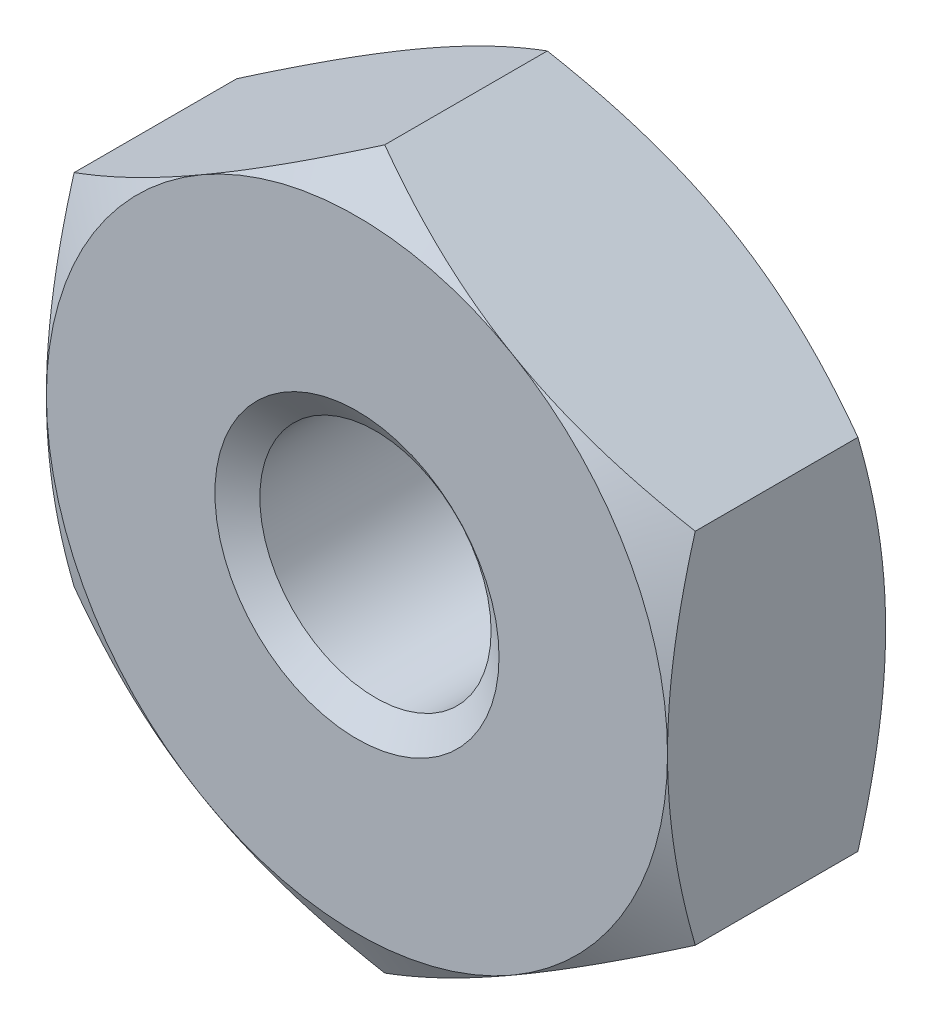
ISO-10303-21;
HEADER;
FILE_DESCRIPTION(('STEP AP214'),'2;1');
FILE_NAME('part.step','',(''),(''),'','','');
FILE_SCHEMA(('AUTOMOTIVE_DESIGN { 1 0 10303 214 1 1 1 1 }'));
ENDSEC;
DATA;
#1=APPLICATION_CONTEXT('core data for automotive mechanical design processes');
#2=APPLICATION_PROTOCOL_DEFINITION('international standard','automotive_design',2000,#1);
#3=PRODUCT_CONTEXT('',#1,'mechanical');
#4=PRODUCT('Part','Part','',(#3));
#5=PRODUCT_RELATED_PRODUCT_CATEGORY('part','',(#4));
#6=PRODUCT_DEFINITION_FORMATION('','',#4);
#7=PRODUCT_DEFINITION_CONTEXT('part definition',#1,'design');
#8=PRODUCT_DEFINITION('design','',#6,#7);
#9=PRODUCT_DEFINITION_SHAPE('','',#8);
#10=(LENGTH_UNIT() NAMED_UNIT(*) SI_UNIT(.MILLI.,.METRE.));
#11=(NAMED_UNIT(*) PLANE_ANGLE_UNIT() SI_UNIT($,.RADIAN.));
#12=(NAMED_UNIT(*) SI_UNIT($,.STERADIAN.) SOLID_ANGLE_UNIT());
#13=UNCERTAINTY_MEASURE_WITH_UNIT(LENGTH_MEASURE(1.E-05),#10,'distance_accuracy_value','');
#14=(GEOMETRIC_REPRESENTATION_CONTEXT(3) GLOBAL_UNCERTAINTY_ASSIGNED_CONTEXT((#13)) GLOBAL_UNIT_ASSIGNED_CONTEXT((#10,
#11,#12)) REPRESENTATION_CONTEXT('',''));
#15=CARTESIAN_POINT('',(0.,0.,0.));
#16=DIRECTION('',(0.,0.,1.));
#17=DIRECTION('',(1.,0.,0.));
#18=AXIS2_PLACEMENT_3D('',#15,#16,#17);
#19=CARTESIAN_POINT('',(0.,0.,-1.6764));
#20=DIRECTION('',(0.,0.,1.));
#21=DIRECTION('',(1.,0.,0.));
#22=AXIS2_PLACEMENT_3D('',#19,#20,#21);
#23=CYLINDRICAL_SURFACE('',#22,0.889);
#24=CARTESIAN_POINT('',(0.,0.,-0.14228217176421));
#25=DIRECTION('',(0.,0.,1.));
#26=DIRECTION('',(1.,0.,0.));
#27=AXIS2_PLACEMENT_3D('',#24,#25,#26);
#28=CIRCLE('',#27,0.889);
#29=CARTESIAN_POINT('',(0.889,0.,-0.14228217176421));
#30=VERTEX_POINT('',#29);
#31=EDGE_CURVE('E173',#30,#30,#28,.F.);
#32=ORIENTED_EDGE('',*,*,#31,.F.);
#33=EDGE_LOOP('',(#32));
#34=FACE_BOUND('',#33,.T.);
#35=CARTESIAN_POINT('',(0.,0.,-1.50871782823579));
#36=DIRECTION('',(0.,0.,-1.));
#37=DIRECTION('',(-1.,0.,0.));
#38=AXIS2_PLACEMENT_3D('',#35,#36,#37);
#39=CIRCLE('',#38,0.889);
#40=CARTESIAN_POINT('',(-0.889,0.,-1.50871782823579));
#41=VERTEX_POINT('',#40);
#42=EDGE_CURVE('E38',#41,#41,#39,.F.);
#43=ORIENTED_EDGE('',*,*,#42,.F.);
#44=EDGE_LOOP('',(#43));
#45=FACE_BOUND('',#44,.T.);
#46=ADVANCED_FACE('F33',(#34,#45),#23,.F.);
#47=CARTESIAN_POINT('',(0.,2.75696300543431,-1.6764));
#48=DIRECTION('',(0.,0.,-1.));
#49=DIRECTION('',(-1.,0.,0.));
#50=AXIS2_PLACEMENT_3D('',#47,#48,#49);
#51=PLANE('',#50);
#52=CARTESIAN_POINT('',(0.,0.,-1.6764));
#53=DIRECTION('',(0.,0.,-1.));
#54=DIRECTION('',(-1.,0.,0.));
#55=AXIS2_PLACEMENT_3D('',#52,#53,#54);
#56=CIRCLE('',#55,2.3876);
#57=CARTESIAN_POINT('',(-2.3876,0.,-1.6764));
#58=VERTEX_POINT('',#57);
#59=CARTESIAN_POINT('',(-1.1938,-2.06772225407572,-1.6764));
#60=VERTEX_POINT('',#59);
#61=EDGE_CURVE('E169',#58,#60,#56,.F.);
#62=ORIENTED_EDGE('',*,*,#61,.F.);
#63=CARTESIAN_POINT('',(-1.19380000000001,2.06772225407572,-1.6764));
#64=VERTEX_POINT('',#63);
#65=EDGE_CURVE('E151',#64,#58,#56,.F.);
#66=ORIENTED_EDGE('',*,*,#65,.F.);
#67=CARTESIAN_POINT('',(1.19380000000001,2.06772225407572,-1.6764));
#68=VERTEX_POINT('',#67);
#69=EDGE_CURVE('E168',#68,#64,#56,.F.);
#70=ORIENTED_EDGE('',*,*,#69,.F.);
#71=CARTESIAN_POINT('',(0.,0.,-1.6764));
#72=DIRECTION('',(0.,0.,1.));
#73=DIRECTION('',(1.,0.,0.));
#74=AXIS2_PLACEMENT_3D('',#71,#72,#73);
#75=CIRCLE('',#74,2.3876);
#76=CARTESIAN_POINT('',(2.3876,0.,-1.6764));
#77=VERTEX_POINT('',#76);
#78=EDGE_CURVE('E243',#77,#68,#75,.T.);
#79=ORIENTED_EDGE('',*,*,#78,.F.);
#80=CARTESIAN_POINT('',(1.19380000000001,-2.06772225407572,-1.6764));
#81=VERTEX_POINT('',#80);
#82=EDGE_CURVE('E359',#81,#77,#56,.F.);
#83=ORIENTED_EDGE('',*,*,#82,.F.);
#84=EDGE_CURVE('E363',#60,#81,#56,.F.);
#85=ORIENTED_EDGE('',*,*,#84,.F.);
#86=EDGE_LOOP('',(#62,#66,#70,#79,#83,#85));
#87=FACE_BOUND('',#86,.T.);
#88=CARTESIAN_POINT('',(0.,0.,-1.6764));
#89=DIRECTION('',(0.,0.,-1.));
#90=DIRECTION('',(-1.,0.,0.));
#91=AXIS2_PLACEMENT_3D('',#88,#89,#90);
#92=CIRCLE('',#91,1.0922);
#93=CARTESIAN_POINT('',(-1.0922,0.,-1.6764));
#94=VERTEX_POINT('',#93);
#95=EDGE_CURVE('E176',#94,#94,#92,.F.);
#96=ORIENTED_EDGE('',*,*,#95,.T.);
#97=EDGE_LOOP('',(#96));
#98=FACE_BOUND('',#97,.T.);
#99=ADVANCED_FACE('F296',(#87,#98),#51,.T.);
#100=CARTESIAN_POINT('',(0.,2.75696300543431,0.));
#101=DIRECTION('',(0.,0.,-1.));
#102=DIRECTION('',(-1.,0.,0.));
#103=AXIS2_PLACEMENT_3D('',#100,#101,#102);
#104=PLANE('',#103);
#105=CARTESIAN_POINT('',(0.,0.,0.));
#106=DIRECTION('',(0.,0.,-1.));
#107=DIRECTION('',(-1.,0.,0.));
#108=AXIS2_PLACEMENT_3D('',#105,#106,#107);
#109=CIRCLE('',#108,2.3876);
#110=CARTESIAN_POINT('',(-2.3876,0.,0.));
#111=VERTEX_POINT('',#110);
#112=CARTESIAN_POINT('',(-1.19380000000001,2.06772225407572,0.));
#113=VERTEX_POINT('',#112);
#114=EDGE_CURVE('E11',#111,#113,#109,.T.);
#115=ORIENTED_EDGE('',*,*,#114,.F.);
#116=CARTESIAN_POINT('',(-1.1938,-2.06772225407572,0.));
#117=VERTEX_POINT('',#116);
#118=EDGE_CURVE('E45',#117,#111,#109,.T.);
#119=ORIENTED_EDGE('',*,*,#118,.F.);
#120=CARTESIAN_POINT('',(1.19380000000001,-2.06772225407572,0.));
#121=VERTEX_POINT('',#120);
#122=EDGE_CURVE('E172',#121,#117,#109,.T.);
#123=ORIENTED_EDGE('',*,*,#122,.F.);
#124=CARTESIAN_POINT('',(2.3876,0.,0.));
#125=VERTEX_POINT('',#124);
#126=EDGE_CURVE('E350',#125,#121,#109,.T.);
#127=ORIENTED_EDGE('',*,*,#126,.F.);
#128=CARTESIAN_POINT('',(0.,0.,0.));
#129=DIRECTION('',(0.,0.,1.));
#130=DIRECTION('',(1.,0.,0.));
#131=AXIS2_PLACEMENT_3D('',#128,#129,#130);
#132=CIRCLE('',#131,2.3876);
#133=CARTESIAN_POINT('',(1.19380000000001,2.06772225407572,0.));
#134=VERTEX_POINT('',#133);
#135=EDGE_CURVE('E127',#125,#134,#132,.T.);
#136=ORIENTED_EDGE('',*,*,#135,.T.);
#137=EDGE_CURVE('E43',#113,#134,#109,.T.);
#138=ORIENTED_EDGE('',*,*,#137,.F.);
#139=EDGE_LOOP('',(#115,#119,#123,#127,#136,#138));
#140=FACE_BOUND('',#139,.T.);
#141=CARTESIAN_POINT('',(0.,0.,0.));
#142=DIRECTION('',(0.,0.,1.));
#143=DIRECTION('',(1.,0.,0.));
#144=AXIS2_PLACEMENT_3D('',#141,#142,#143);
#145=CIRCLE('',#144,1.0922);
#146=CARTESIAN_POINT('',(1.0922,0.,0.));
#147=VERTEX_POINT('',#146);
#148=EDGE_CURVE('E175',#147,#147,#145,.T.);
#149=ORIENTED_EDGE('',*,*,#148,.F.);
#150=EDGE_LOOP('',(#149));
#151=FACE_BOUND('',#150,.T.);
#152=ADVANCED_FACE('F248',(#140,#151),#104,.F.);
#153=CARTESIAN_POINT('',(0.,2.75696300543431,-1.6764));
#154=DIRECTION('',(-0.500000000000004,0.866025403784436,0.));
#155=DIRECTION('',(-0.866025403784436,-0.500000000000004,0.));
#156=AXIS2_PLACEMENT_3D('',#153,#154,#155);
#157=PLANE('',#156);
#158=DIRECTION('',(0.,0.,1.));
#159=VECTOR('',#158,1.);
#160=CARTESIAN_POINT('',(-2.3876,1.37848150271714,-1.6764));
#161=LINE('',#160,#159);
#162=CARTESIAN_POINT('',(-2.3876,1.37848150271716,-1.46314816938381));
#163=VERTEX_POINT('',#162);
#164=CARTESIAN_POINT('',(-2.3876,1.37848150271714,-0.213251830616181));
#165=VERTEX_POINT('',#164);
#166=EDGE_CURVE('E163',#163,#165,#161,.T.);
#167=ORIENTED_EDGE('',*,*,#166,.T.);
#168=CARTESIAN_POINT('',(-2.3878,1.3783660326633,-0.213318501470979));
#169=CARTESIAN_POINT('',(-2.28287606453564,1.43894389504809,-0.178329367585888));
#170=CARTESIAN_POINT('',(-2.17704643460647,1.50004466037593,-0.146507745229369));
#171=CARTESIAN_POINT('',(-1.96355453037943,1.62330426875122,-0.0909621397075383));
#172=CARTESIAN_POINT('',(-1.85588846194031,1.68546530234714,-0.0672578076475622));
#173=CARTESIAN_POINT('',(-1.64189067804026,1.80901698048781,-0.0303576796709481));
#174=CARTESIAN_POINT('',(-1.53559189340191,1.8703886124133,-0.0169163088441156));
#175=CARTESIAN_POINT('',(-1.32249401746025,1.99342072845196,-0.000868578218158918));
#176=CARTESIAN_POINT('',(-1.21569570098293,2.05508076521913,0.00175106886924207));
#177=CARTESIAN_POINT('',(-1.01612814269019,2.17030114872096,-0.00369159153788402));
#178=CARTESIAN_POINT('',(-0.923329063406968,2.22387872212568,-0.0104175391417704));
#179=CARTESIAN_POINT('',(-0.738335505406029,2.33068480263587,-0.0317370557583221));
#180=CARTESIAN_POINT('',(-0.646141666797156,2.38391294017433,-0.0463379112564599));
#181=CARTESIAN_POINT('',(-0.460766524191895,2.49093932865855,-0.0828397901525214));
#182=CARTESIAN_POINT('',(-0.367608688702193,2.54472403005565,-0.104895581600362));
#183=CARTESIAN_POINT('',(-0.182682641216108,2.65149113335191,-0.154953888652165));
#184=CARTESIAN_POINT('',(-0.0909120590697554,2.7044749036578,-0.182944638241838));
#185=CARTESIAN_POINT('',(0.000199999999998261,2.75707847548814,-0.213318501470984));
#186=B_SPLINE_CURVE_WITH_KNOTS('',3,(#168,#169,#170,#171,#172,#173,#174,#175,#176,#177,#178,
#179,#180,#181,#182,#183,#184,#185),.UNSPECIFIED.,.F.,.F.,(4,2,2,2,2,2,2,2,4),(0.,
0.378469527554648,0.757848917720108,1.12783830118146,1.49737326355505,1.81916504067612,
2.14125507699893,2.47049068028368,2.79907957904289),.UNSPECIFIED.);
#187=EDGE_CURVE('E132',#165,#113,#186,.T.);
#188=ORIENTED_EDGE('',*,*,#187,.T.);
#189=CARTESIAN_POINT('',(0.,2.75696300543431,-0.213251830616187));
#190=VERTEX_POINT('',#189);
#191=EDGE_CURVE('E52',#113,#190,#186,.T.);
#192=ORIENTED_EDGE('',*,*,#191,.T.);
#193=DIRECTION('',(0.,0.,1.));
#194=VECTOR('',#193,1.);
#195=CARTESIAN_POINT('',(0.,2.75696300543431,-1.6764));
#196=LINE('',#195,#194);
#197=CARTESIAN_POINT('',(0.,2.75696300543431,-1.46314816938381));
#198=VERTEX_POINT('',#197);
#199=EDGE_CURVE('E148',#198,#190,#196,.T.);
#200=ORIENTED_EDGE('',*,*,#199,.F.);
#201=CARTESIAN_POINT('',(-2.3878,1.3783660326633,-1.46308149852902));
#202=CARTESIAN_POINT('',(-2.28287606453564,1.43894389504809,-1.49807063241411));
#203=CARTESIAN_POINT('',(-2.17704643460647,1.50004466037593,-1.52989225477063));
#204=CARTESIAN_POINT('',(-1.96355453037943,1.62330426875122,-1.58543786029246));
#205=CARTESIAN_POINT('',(-1.85588846194031,1.68546530234714,-1.60914219235244));
#206=CARTESIAN_POINT('',(-1.64189067804026,1.80901698048781,-1.64604232032905));
#207=CARTESIAN_POINT('',(-1.53559189340191,1.8703886124133,-1.65948369115588));
#208=CARTESIAN_POINT('',(-1.32249401746025,1.99342072845196,-1.67553142178184));
#209=CARTESIAN_POINT('',(-1.21569570098293,2.05508076521913,-1.67815106886924));
#210=CARTESIAN_POINT('',(-1.01612814269019,2.17030114872096,-1.67270840846212));
#211=CARTESIAN_POINT('',(-0.923329063406969,2.22387872212568,-1.66598246085823));
#212=CARTESIAN_POINT('',(-0.73833550540603,2.33068480263587,-1.64466294424168));
#213=CARTESIAN_POINT('',(-0.646141666797157,2.38391294017433,-1.63006208874354));
#214=CARTESIAN_POINT('',(-0.460766524191895,2.49093932865855,-1.59356020984748));
#215=CARTESIAN_POINT('',(-0.367608688702193,2.54472403005565,-1.57150441839964));
#216=CARTESIAN_POINT('',(-0.182682641216109,2.65149113335191,-1.52144611134783));
#217=CARTESIAN_POINT('',(-0.0909120590697558,2.7044749036578,-1.49345536175816));
#218=CARTESIAN_POINT('',(0.000199999999998295,2.75707847548814,-1.46308149852902));
#219=B_SPLINE_CURVE_WITH_KNOTS('',3,(#201,#202,#203,#204,#205,#206,#207,#208,#209,#210,#211,
#212,#213,#214,#215,#216,#217,#218),.UNSPECIFIED.,.F.,.F.,(4,2,2,2,2,2,2,2,4),(0.,
0.378469527554648,0.757848917720108,1.12783830118146,1.49737326355505,1.81916504067612,
2.14125507699893,2.47049068028368,2.79907957904288),.UNSPECIFIED.);
#220=EDGE_CURVE('E166',#64,#198,#219,.T.);
#221=ORIENTED_EDGE('',*,*,#220,.F.);
#222=EDGE_CURVE('E258',#163,#64,#219,.T.);
#223=ORIENTED_EDGE('',*,*,#222,.F.);
#224=EDGE_LOOP('',(#167,#188,#192,#200,#221,#223));
#225=FACE_BOUND('',#224,.T.);
#226=ADVANCED_FACE('F35',(#225),#157,.T.);
#227=CARTESIAN_POINT('',(2.3876,1.37848150271715,-1.6764));
#228=DIRECTION('',(0.500000000000003,0.866025403784437,0.));
#229=DIRECTION('',(-0.866025403784437,0.500000000000003,0.));
#230=AXIS2_PLACEMENT_3D('',#227,#228,#229);
#231=PLANE('',#230);
#232=ORIENTED_EDGE('',*,*,#199,.T.);
#233=CARTESIAN_POINT('',(-0.000200000000001865,2.75707847548814,-0.213318501470985));
#234=CARTESIAN_POINT('',(0.104723935464362,2.69650061310336,-0.178329367585893));
#235=CARTESIAN_POINT('',(0.21055356539353,2.63539984777552,-0.146507745229374));
#236=CARTESIAN_POINT('',(0.424045469620568,2.51214023940023,-0.0909621397075422));
#237=CARTESIAN_POINT('',(0.531711538059694,2.44997920580431,-0.0672578076475657));
#238=CARTESIAN_POINT('',(0.745709321959737,2.32642752766364,-0.0303576796709507));
#239=CARTESIAN_POINT('',(0.852008106598094,2.26505589573815,-0.0169163088441176));
#240=CARTESIAN_POINT('',(1.06510598253976,2.14202377969949,-0.000868578218159695));
#241=CARTESIAN_POINT('',(1.17190429901707,2.08036374293232,0.00175106886924187));
#242=CARTESIAN_POINT('',(1.37147185730981,1.96514335943049,-0.00369159153788347));
#243=CARTESIAN_POINT('',(1.46427093659303,1.91156578602577,-0.0104175391417696));
#244=CARTESIAN_POINT('',(1.64926449459397,1.80475970551558,-0.0317370557583204));
#245=CARTESIAN_POINT('',(1.74145833320285,1.75153156797712,-0.0463379112564577));
#246=CARTESIAN_POINT('',(1.92683347580811,1.64450517949291,-0.0828397901525183));
#247=CARTESIAN_POINT('',(2.01999131129781,1.5907204780958,-0.104895581600359));
#248=CARTESIAN_POINT('',(2.20491735878389,1.48395337479954,-0.154953888652161));
#249=CARTESIAN_POINT('',(2.29668794093024,1.43096960449365,-0.182944638241833));
#250=CARTESIAN_POINT('',(2.3878,1.37836603266331,-0.213318501470979));
#251=B_SPLINE_CURVE_WITH_KNOTS('',3,(#233,#234,#235,#236,#237,#238,#239,#240,#241,#242,#243,
#244,#245,#246,#247,#248,#249,#250),.UNSPECIFIED.,.F.,.F.,(4,2,2,2,2,2,2,2,4),(0.,
0.378469527554649,0.757848917720111,1.12783830118146,1.49737326355505,1.81916504067612,
2.14125507699893,2.47049068028368,2.79907957904288),.UNSPECIFIED.);
#252=EDGE_CURVE('E142',#190,#134,#251,.T.);
#253=ORIENTED_EDGE('',*,*,#252,.T.);
#254=CARTESIAN_POINT('',(2.3876,1.37848150271717,-0.213251830616187));
#255=VERTEX_POINT('',#254);
#256=EDGE_CURVE('E59',#134,#255,#251,.T.);
#257=ORIENTED_EDGE('',*,*,#256,.T.);
#258=DIRECTION('',(0.,0.,1.));
#259=VECTOR('',#258,1.);
#260=CARTESIAN_POINT('',(2.3876,1.37848150271715,-1.6764));
#261=LINE('',#260,#259);
#262=CARTESIAN_POINT('',(2.3876,1.37848150271717,-1.46314816938381));
#263=VERTEX_POINT('',#262);
#264=EDGE_CURVE('E141',#263,#255,#261,.T.);
#265=ORIENTED_EDGE('',*,*,#264,.F.);
#266=CARTESIAN_POINT('',(-0.000200000000001872,2.75707847548814,-1.46308149852902));
#267=CARTESIAN_POINT('',(0.104723935464362,2.69650061310336,-1.49807063241411));
#268=CARTESIAN_POINT('',(0.21055356539353,2.63539984777551,-1.52989225477063));
#269=CARTESIAN_POINT('',(0.424045469620568,2.51214023940023,-1.58543786029246));
#270=CARTESIAN_POINT('',(0.531711538059694,2.44997920580431,-1.60914219235243));
#271=CARTESIAN_POINT('',(0.745709321959737,2.32642752766364,-1.64604232032905));
#272=CARTESIAN_POINT('',(0.852008106598094,2.26505589573815,-1.65948369115588));
#273=CARTESIAN_POINT('',(1.06510598253976,2.14202377969949,-1.67553142178184));
#274=CARTESIAN_POINT('',(1.17190429901707,2.08036374293232,-1.67815106886924));
#275=CARTESIAN_POINT('',(1.37147185730981,1.96514335943049,-1.67270840846212));
#276=CARTESIAN_POINT('',(1.46427093659303,1.91156578602577,-1.66598246085823));
#277=CARTESIAN_POINT('',(1.64926449459397,1.80475970551558,-1.64466294424168));
#278=CARTESIAN_POINT('',(1.74145833320285,1.75153156797712,-1.63006208874354));
#279=CARTESIAN_POINT('',(1.92683347580811,1.64450517949291,-1.59356020984748));
#280=CARTESIAN_POINT('',(2.01999131129781,1.5907204780958,-1.57150441839964));
#281=CARTESIAN_POINT('',(2.20491735878389,1.48395337479954,-1.52144611134784));
#282=CARTESIAN_POINT('',(2.29668794093025,1.43096960449365,-1.49345536175817));
#283=CARTESIAN_POINT('',(2.3878,1.37836603266331,-1.46308149852902));
#284=B_SPLINE_CURVE_WITH_KNOTS('',3,(#266,#267,#268,#269,#270,#271,#272,#273,#274,#275,#276,
#277,#278,#279,#280,#281,#282,#283),.UNSPECIFIED.,.F.,.F.,(4,2,2,2,2,2,2,2,4),(0.,
0.378469527554649,0.757848917720111,1.12783830118146,1.49737326355505,1.81916504067612,
2.14125507699893,2.47049068028368,2.79907957904288),.UNSPECIFIED.);
#285=EDGE_CURVE('E252',#68,#263,#284,.T.);
#286=ORIENTED_EDGE('',*,*,#285,.F.);
#287=EDGE_CURVE('E257',#198,#68,#284,.T.);
#288=ORIENTED_EDGE('',*,*,#287,.F.);
#289=EDGE_LOOP('',(#232,#253,#257,#265,#286,#288));
#290=FACE_BOUND('',#289,.T.);
#291=ADVANCED_FACE('F139',(#290),#231,.T.);
#292=CARTESIAN_POINT('',(2.3876,1.37848150271715,-1.6764));
#293=DIRECTION('',(-1.,0.,0.));
#294=DIRECTION('',(0.,0.,1.));
#295=AXIS2_PLACEMENT_3D('',#292,#293,#294);
#296=PLANE('',#295);
#297=CARTESIAN_POINT('',(2.3876,-3.65593609080649,-1.14253036159854));
#298=CARTESIAN_POINT('',(2.3876,-3.55110694918386,-1.09187113002077));
#299=CARTESIAN_POINT('',(2.3876,-3.44602995685677,-1.04171549313264));
#300=CARTESIAN_POINT('',(2.3876,-3.23524625803962,-0.94269918012323));
#301=CARTESIAN_POINT('',(2.3876,-3.12953944635139,-0.893838728210004));
#302=CARTESIAN_POINT('',(2.3876,-2.91679107639573,-0.797443156999656));
#303=CARTESIAN_POINT('',(2.3876,-2.80974534161061,-0.74991722213313));
#304=CARTESIAN_POINT('',(2.3876,-2.59477405010642,-0.656906706437378));
#305=CARTESIAN_POINT('',(2.3876,-2.48684853959578,-0.61142201920174));
#306=CARTESIAN_POINT('',(2.3876,-2.26860623456077,-0.522496803220397));
#307=CARTESIAN_POINT('',(2.3876,-2.15827634925912,-0.47908822594844));
#308=CARTESIAN_POINT('',(2.3876,-1.93631522811917,-0.395670822259679));
#309=CARTESIAN_POINT('',(2.3876,-1.82468384906324,-0.355662374089448));
#310=CARTESIAN_POINT('',(2.3876,-1.60017141965676,-0.280120244638395));
#311=CARTESIAN_POINT('',(2.3876,-1.487293603322,-0.244577050022474));
#312=CARTESIAN_POINT('',(2.3876,-1.2599332647214,-0.179119755521417));
#313=CARTESIAN_POINT('',(2.3876,-1.14545126227174,-0.149203875516054));
#314=CARTESIAN_POINT('',(2.3876,-0.914804359975561,-0.0964535455080679));
#315=CARTESIAN_POINT('',(2.3876,-0.798639020636922,-0.073620981027459));
#316=CARTESIAN_POINT('',(2.3876,-0.564907787073333,-0.0365745914220467));
#317=CARTESIAN_POINT('',(2.3876,-0.447341891610209,-0.0223607739172988));
#318=CARTESIAN_POINT('',(2.3876,-0.212169292608925,-0.00380930426889781));
#319=CARTESIAN_POINT('',(2.3876,-0.0945676495920213,0.000590871764266426));
#320=CARTESIAN_POINT('',(2.3876,0.140553287899092,-0.000718707219114439));
#321=CARTESIAN_POINT('',(2.3876,0.25807259582575,-0.00642583790168171));
#322=CARTESIAN_POINT('',(2.3876,0.458753843166106,-0.024400516690851));
#323=CARTESIAN_POINT('',(2.3876,0.542137181712102,-0.0343272988086084));
#324=CARTESIAN_POINT('',(2.3876,0.708259747560009,-0.0586235846359388));
#325=CARTESIAN_POINT('',(2.3876,0.790998871167441,-0.0729937890101849));
#326=CARTESIAN_POINT('',(2.3876,1.03818247230877,-0.122015355850191));
#327=CARTESIAN_POINT('',(2.3876,1.20146831776594,-0.162565050307172));
#328=CARTESIAN_POINT('',(2.3876,1.44580075224368,-0.232502314876436));
#329=CARTESIAN_POINT('',(2.3876,1.52812092254201,-0.257690051867363));
#330=CARTESIAN_POINT('',(2.3876,1.69190206167627,-0.310557865937948));
#331=CARTESIAN_POINT('',(2.3876,1.773363580432,-0.338236223967965));
#332=CARTESIAN_POINT('',(2.3876,1.93508677044203,-0.395509341840709));
#333=CARTESIAN_POINT('',(2.3876,2.01535261438467,-0.42509243798226));
#334=CARTESIAN_POINT('',(2.3876,2.17526154662173,-0.485994997377666));
#335=CARTESIAN_POINT('',(2.3876,2.25490436816689,-0.517315162412031));
#336=CARTESIAN_POINT('',(2.3876,2.33425921925151,-0.549332446004792));
#337=B_SPLINE_CURVE_WITH_KNOTS('',3,(#297,#298,#299,#300,#301,#302,#303,#304,#305,#306,#307,
#308,#309,#310,#311,#312,#313,#314,#315,#316,#317,#318,#319,#320,#321,#322,#323,#324,#325,#326,
#327,#328,#329,#330,#331,#332,#333,#334,#335,#336),.UNSPECIFIED.,.F.,.F.,(4,2,2,2,2,2,2,2,2,2,2,
2,2,2,2,2,2,2,2,4),(0.,0.349289042962513,0.698638161244704,1.04998646344191,1.40131642918613,
1.75695963655398,2.1126423557206,2.46755394737998,2.82235307834569,3.17724657312797,
3.53214038168024,3.88476658086275,4.23730123505986,4.48909473258754,4.74092795464398,
5.24496920192682,5.5032107676473,5.76127544014718,6.01788755129246,6.27460410049568),.UNSPECIFIED.);
#338=CARTESIAN_POINT('',(2.3876,-1.37848150271716,-0.213251830616187));
#339=VERTEX_POINT('',#338);
#340=EDGE_CURVE('E134',#339,#125,#337,.T.);
#341=ORIENTED_EDGE('',*,*,#340,.F.);
#342=DIRECTION('',(0.,0.,1.));
#343=VECTOR('',#342,1.);
#344=CARTESIAN_POINT('',(2.3876,-1.37848150271716,-1.6764));
#345=LINE('',#344,#343);
#346=CARTESIAN_POINT('',(2.3876,-1.37848150271716,-1.46314816938381));
#347=VERTEX_POINT('',#346);
#348=EDGE_CURVE('E149',#347,#339,#345,.T.);
#349=ORIENTED_EDGE('',*,*,#348,.F.);
#350=CARTESIAN_POINT('',(2.3876,-3.65593609080648,-0.533869638401462));
#351=CARTESIAN_POINT('',(2.3876,-3.55110694918386,-0.584528869979238));
#352=CARTESIAN_POINT('',(2.3876,-3.44602995685677,-0.634684506867364));
#353=CARTESIAN_POINT('',(2.3876,-3.23524625803961,-0.733700819876772));
#354=CARTESIAN_POINT('',(2.3876,-3.12953944635139,-0.782561271789999));
#355=CARTESIAN_POINT('',(2.3876,-2.91679107639573,-0.878956843000347));
#356=CARTESIAN_POINT('',(2.3876,-2.80974534161061,-0.926482777866872));
#357=CARTESIAN_POINT('',(2.3876,-2.59477405010642,-1.01949329356262));
#358=CARTESIAN_POINT('',(2.3876,-2.48684853959578,-1.06497798079826));
#359=CARTESIAN_POINT('',(2.3876,-2.26860623456077,-1.1539031967796));
#360=CARTESIAN_POINT('',(2.3876,-2.15827634925912,-1.19731177405156));
#361=CARTESIAN_POINT('',(2.3876,-1.93631522811917,-1.28072917774032));
#362=CARTESIAN_POINT('',(2.3876,-1.82468384906324,-1.32073762591055));
#363=CARTESIAN_POINT('',(2.3876,-1.60017141965676,-1.39627975536161));
#364=CARTESIAN_POINT('',(2.3876,-1.487293603322,-1.43182294997753));
#365=CARTESIAN_POINT('',(2.3876,-1.2599332647214,-1.49728024447858));
#366=CARTESIAN_POINT('',(2.3876,-1.14545126227174,-1.52719612448395));
#367=CARTESIAN_POINT('',(2.3876,-0.914804359975562,-1.57994645449193));
#368=CARTESIAN_POINT('',(2.3876,-0.798639020636923,-1.60277901897254));
#369=CARTESIAN_POINT('',(2.3876,-0.564907787073334,-1.63982540857795));
#370=CARTESIAN_POINT('',(2.3876,-0.447341891610209,-1.6540392260827));
#371=CARTESIAN_POINT('',(2.3876,-0.212169292608925,-1.6725906957311));
#372=CARTESIAN_POINT('',(2.3876,-0.0945676495920215,-1.67699087176427));
#373=CARTESIAN_POINT('',(2.3876,0.140553287899092,-1.67568129278089));
#374=CARTESIAN_POINT('',(2.3876,0.258072595825749,-1.66997416209832));
#375=CARTESIAN_POINT('',(2.3876,0.458753843166105,-1.65199948330915));
#376=CARTESIAN_POINT('',(2.3876,0.542137181712102,-1.64207270119139));
#377=CARTESIAN_POINT('',(2.3876,0.708259747560009,-1.61777641536406));
#378=CARTESIAN_POINT('',(2.3876,0.790998871167442,-1.60340621098982));
#379=CARTESIAN_POINT('',(2.3876,1.03818247230877,-1.55438464414981));
#380=CARTESIAN_POINT('',(2.3876,1.20146831776594,-1.51383494969283));
#381=CARTESIAN_POINT('',(2.3876,1.44580075224369,-1.44389768512356));
#382=CARTESIAN_POINT('',(2.3876,1.52812092254202,-1.41870994813264));
#383=CARTESIAN_POINT('',(2.3876,1.69190206167627,-1.36584213406205));
#384=CARTESIAN_POINT('',(2.3876,1.77336358043201,-1.33816377603203));
#385=CARTESIAN_POINT('',(2.3876,1.93508677044203,-1.28089065815929));
#386=CARTESIAN_POINT('',(2.3876,2.01535261438467,-1.25130756201774));
#387=CARTESIAN_POINT('',(2.3876,2.17526154662174,-1.19040500262233));
#388=CARTESIAN_POINT('',(2.3876,2.2549043681669,-1.15908483758797));
#389=CARTESIAN_POINT('',(2.3876,2.33425921925151,-1.12706755399521));
#390=B_SPLINE_CURVE_WITH_KNOTS('',3,(#350,#351,#352,#353,#354,#355,#356,#357,#358,#359,#360,
#361,#362,#363,#364,#365,#366,#367,#368,#369,#370,#371,#372,#373,#374,#375,#376,#377,#378,#379,
#380,#381,#382,#383,#384,#385,#386,#387,#388,#389),.UNSPECIFIED.,.F.,.F.,(4,2,2,2,2,2,2,2,2,2,2,
2,2,2,2,2,2,2,2,4),(0.,0.349289042962513,0.698638161244704,1.04998646344191,1.40131642918613,
1.75695963655398,2.1126423557206,2.46755394737998,2.82235307834569,3.17724657312796,
3.53214038168024,3.88476658086274,4.23730123505986,4.48909473258753,4.74092795464398,
5.24496920192682,5.5032107676473,5.76127544014718,6.01788755129247,6.27460410049568),.UNSPECIFIED.);
#391=EDGE_CURVE('E264',#347,#77,#390,.T.);
#392=ORIENTED_EDGE('',*,*,#391,.T.);
#393=EDGE_CURVE('E147',#77,#263,#390,.T.);
#394=ORIENTED_EDGE('',*,*,#393,.T.);
#395=ORIENTED_EDGE('',*,*,#264,.T.);
#396=EDGE_CURVE('E124',#125,#255,#337,.T.);
#397=ORIENTED_EDGE('',*,*,#396,.F.);
#398=EDGE_LOOP('',(#341,#349,#392,#394,#395,#397));
#399=FACE_BOUND('',#398,.T.);
#400=ADVANCED_FACE('F145',(#399),#296,.F.);
#401=CARTESIAN_POINT('',(0.,-2.75696300543432,-1.6764));
#402=DIRECTION('',(0.500000000000004,-0.866025403784436,0.));
#403=DIRECTION('',(0.866025403784437,0.500000000000004,0.));
#404=AXIS2_PLACEMENT_3D('',#401,#402,#403);
#405=PLANE('',#404);
#406=ORIENTED_EDGE('',*,*,#348,.T.);
#407=CARTESIAN_POINT('',(2.3878,-1.37836603266332,-0.213318501470983));
#408=CARTESIAN_POINT('',(2.28287606453563,-1.43894389504811,-0.178329367585892));
#409=CARTESIAN_POINT('',(2.17704643460647,-1.50004466037595,-0.146507745229374));
#410=CARTESIAN_POINT('',(1.96355453037943,-1.62330426875124,-0.0909621397075433));
#411=CARTESIAN_POINT('',(1.8558884619403,-1.68546530234716,-0.0672578076475676));
#412=CARTESIAN_POINT('',(1.64189067804026,-1.80901698048783,-0.0303576796709543));
#413=CARTESIAN_POINT('',(1.5355918934019,-1.87038861241332,-0.0169163088441221));
#414=CARTESIAN_POINT('',(1.32249401746024,-1.99342072845198,-0.000868578218165941));
#415=CARTESIAN_POINT('',(1.21569570098293,-2.05508076521915,0.00175106886923479));
#416=CARTESIAN_POINT('',(1.01612814269019,-2.17030114872098,-0.00369159153789206));
#417=CARTESIAN_POINT('',(0.923329063406963,-2.2238787221257,-0.0104175391417789));
#418=CARTESIAN_POINT('',(0.738335505406025,-2.33068480263589,-0.0317370557583309));
#419=CARTESIAN_POINT('',(0.646141666797152,-2.38391294017435,-0.0463379112564687));
#420=CARTESIAN_POINT('',(0.460766524191892,-2.49093932865856,-0.0828397901525303));
#421=CARTESIAN_POINT('',(0.36760868870219,-2.54472403005567,-0.104895581600371));
#422=CARTESIAN_POINT('',(0.182682641216107,-2.65149113335193,-0.154953888652174));
#423=CARTESIAN_POINT('',(0.0909120590697542,-2.70447490365782,-0.182944638241847));
#424=CARTESIAN_POINT('',(-0.000199999999999477,-2.75707847548816,-0.213318501470993));
#425=B_SPLINE_CURVE_WITH_KNOTS('',3,(#407,#408,#409,#410,#411,#412,#413,#414,#415,#416,#417,
#418,#419,#420,#421,#422,#423,#424),.UNSPECIFIED.,.F.,.F.,(4,2,2,2,2,2,2,2,4),(0.,
0.378469527554649,0.75784891772011,1.12783830118146,1.49737326355505,1.81916504067612,
2.14125507699893,2.47049068028368,2.79907957904288),.UNSPECIFIED.);
#426=EDGE_CURVE('E345',#339,#121,#425,.T.);
#427=ORIENTED_EDGE('',*,*,#426,.T.);
#428=CARTESIAN_POINT('',(0.,-2.75696300543431,-0.213251830616187));
#429=VERTEX_POINT('',#428);
#430=EDGE_CURVE('E224',#121,#429,#425,.T.);
#431=ORIENTED_EDGE('',*,*,#430,.T.);
#432=DIRECTION('',(0.,0.,1.));
#433=VECTOR('',#432,1.);
#434=CARTESIAN_POINT('',(0.,-2.75696300543432,-1.6764));
#435=LINE('',#434,#433);
#436=CARTESIAN_POINT('',(0.,-2.75696300543431,-1.46314816938381));
#437=VERTEX_POINT('',#436);
#438=EDGE_CURVE('E154',#437,#429,#435,.T.);
#439=ORIENTED_EDGE('',*,*,#438,.F.);
#440=CARTESIAN_POINT('',(2.3878,-1.37836603266332,-1.46308149852902));
#441=CARTESIAN_POINT('',(2.28287606453563,-1.43894389504811,-1.49807063241411));
#442=CARTESIAN_POINT('',(2.17704643460647,-1.50004466037595,-1.52989225477063));
#443=CARTESIAN_POINT('',(1.96355453037943,-1.62330426875124,-1.58543786029246));
#444=CARTESIAN_POINT('',(1.8558884619403,-1.68546530234716,-1.60914219235243));
#445=CARTESIAN_POINT('',(1.64189067804026,-1.80901698048783,-1.64604232032905));
#446=CARTESIAN_POINT('',(1.5355918934019,-1.87038861241332,-1.65948369115588));
#447=CARTESIAN_POINT('',(1.32249401746024,-1.99342072845198,-1.67553142178183));
#448=CARTESIAN_POINT('',(1.21569570098293,-2.05508076521915,-1.67815106886923));
#449=CARTESIAN_POINT('',(1.01612814269019,-2.17030114872098,-1.67270840846211));
#450=CARTESIAN_POINT('',(0.923329063406963,-2.2238787221257,-1.66598246085822));
#451=CARTESIAN_POINT('',(0.738335505406025,-2.33068480263589,-1.64466294424167));
#452=CARTESIAN_POINT('',(0.646141666797152,-2.38391294017435,-1.63006208874353));
#453=CARTESIAN_POINT('',(0.460766524191892,-2.49093932865856,-1.59356020984747));
#454=CARTESIAN_POINT('',(0.36760868870219,-2.54472403005567,-1.57150441839963));
#455=CARTESIAN_POINT('',(0.182682641216107,-2.65149113335193,-1.52144611134783));
#456=CARTESIAN_POINT('',(0.0909120590697539,-2.70447490365782,-1.49345536175815));
#457=CARTESIAN_POINT('',(-0.000199999999999641,-2.75707847548816,-1.46308149852901));
#458=B_SPLINE_CURVE_WITH_KNOTS('',3,(#440,#441,#442,#443,#444,#445,#446,#447,#448,#449,#450,
#451,#452,#453,#454,#455,#456,#457),.UNSPECIFIED.,.F.,.F.,(4,2,2,2,2,2,2,2,4),(0.,
0.378469527554649,0.75784891772011,1.12783830118146,1.49737326355505,1.81916504067612,
2.14125507699893,2.47049068028368,2.79907957904288),.UNSPECIFIED.);
#459=EDGE_CURVE('E270',#81,#437,#458,.T.);
#460=ORIENTED_EDGE('',*,*,#459,.F.);
#461=EDGE_CURVE('E269',#347,#81,#458,.T.);
#462=ORIENTED_EDGE('',*,*,#461,.F.);
#463=EDGE_LOOP('',(#406,#427,#431,#439,#460,#462));
#464=FACE_BOUND('',#463,.T.);
#465=ADVANCED_FACE('F280',(#464),#405,.T.);
#466=CARTESIAN_POINT('',(-2.3876,-1.37848150271716,-1.6764));
#467=DIRECTION('',(-0.500000000000002,-0.866025403784437,0.));
#468=DIRECTION('',(0.866025403784438,-0.500000000000002,0.));
#469=AXIS2_PLACEMENT_3D('',#466,#467,#468);
#470=PLANE('',#469);
#471=ORIENTED_EDGE('',*,*,#438,.T.);
#472=CARTESIAN_POINT('',(0.000200000000000635,-2.75707847548816,-0.213318501470993));
#473=CARTESIAN_POINT('',(-0.104723935464364,-2.69650061310337,-0.178329367585902));
#474=CARTESIAN_POINT('',(-0.210553565393532,-2.63539984777553,-0.146507745229383));
#475=CARTESIAN_POINT('',(-0.424045469620571,-2.51214023940024,-0.0909621397075506));
#476=CARTESIAN_POINT('',(-0.531711538059699,-2.44997920580432,-0.0672578076475739));
#477=CARTESIAN_POINT('',(-0.745709321959743,-2.32642752766365,-0.0303576796709588));
#478=CARTESIAN_POINT('',(-0.852008106598101,-2.26505589573816,-0.0169163088441256));
#479=CARTESIAN_POINT('',(-1.06510598253976,-2.1420237796995,-0.000868578218168017));
#480=CARTESIAN_POINT('',(-1.17190429901708,-2.08036374293233,0.00175106886923329));
#481=CARTESIAN_POINT('',(-1.37147185730982,-1.9651433594305,-0.00369159153789223));
#482=CARTESIAN_POINT('',(-1.46427093659304,-1.91156578602578,-0.0104175391417782));
#483=CARTESIAN_POINT('',(-1.64926449459398,-1.80475970551559,-0.0317370557583288));
#484=CARTESIAN_POINT('',(-1.74145833320285,-1.75153156797713,-0.0463379112564659));
#485=CARTESIAN_POINT('',(-1.92683347580811,-1.64450517949292,-0.0828397901525261));
#486=CARTESIAN_POINT('',(-2.01999131129781,-1.59072047809582,-0.104895581600366));
#487=CARTESIAN_POINT('',(-2.20491735878389,-1.48395337479955,-0.154953888652168));
#488=CARTESIAN_POINT('',(-2.29668794093025,-1.43096960449367,-0.18294463824184));
#489=CARTESIAN_POINT('',(-2.3878,-1.37836603266333,-0.213318501470985));
#490=B_SPLINE_CURVE_WITH_KNOTS('',3,(#472,#473,#474,#475,#476,#477,#478,#479,#480,#481,#482,
#483,#484,#485,#486,#487,#488,#489),.UNSPECIFIED.,.F.,.F.,(4,2,2,2,2,2,2,2,4),(0.,
0.378469527554651,0.757848917720115,1.12783830118147,1.49737326355506,1.81916504067613,
2.14125507699893,2.47049068028368,2.79907957904288),.UNSPECIFIED.);
#491=EDGE_CURVE('E343',#429,#117,#490,.T.);
#492=ORIENTED_EDGE('',*,*,#491,.T.);
#493=CARTESIAN_POINT('',(-2.3876,-1.37848150271716,-0.213251830616187));
#494=VERTEX_POINT('',#493);
#495=EDGE_CURVE('E198',#117,#494,#490,.T.);
#496=ORIENTED_EDGE('',*,*,#495,.T.);
#497=DIRECTION('',(0.,0.,1.));
#498=VECTOR('',#497,1.);
#499=CARTESIAN_POINT('',(-2.3876,-1.37848150271716,-1.6764));
#500=LINE('',#499,#498);
#501=CARTESIAN_POINT('',(-2.3876,-1.37848150271716,-1.46314816938381));
#502=VERTEX_POINT('',#501);
#503=EDGE_CURVE('E160',#502,#494,#500,.T.);
#504=ORIENTED_EDGE('',*,*,#503,.F.);
#505=CARTESIAN_POINT('',(0.000200000000000635,-2.75707847548816,-1.46308149852901));
#506=CARTESIAN_POINT('',(-0.104723935464364,-2.69650061310337,-1.4980706324141));
#507=CARTESIAN_POINT('',(-0.210553565393532,-2.63539984777553,-1.52989225477062));
#508=CARTESIAN_POINT('',(-0.424045469620571,-2.51214023940024,-1.58543786029245));
#509=CARTESIAN_POINT('',(-0.531711538059698,-2.44997920580432,-1.60914219235243));
#510=CARTESIAN_POINT('',(-0.745709321959743,-2.32642752766365,-1.64604232032904));
#511=CARTESIAN_POINT('',(-0.8520081065981,-2.26505589573816,-1.65948369115587));
#512=CARTESIAN_POINT('',(-1.06510598253976,-2.1420237796995,-1.67553142178183));
#513=CARTESIAN_POINT('',(-1.17190429901708,-2.08036374293233,-1.67815106886923));
#514=CARTESIAN_POINT('',(-1.37147185730982,-1.9651433594305,-1.67270840846211));
#515=CARTESIAN_POINT('',(-1.46427093659304,-1.91156578602578,-1.66598246085822));
#516=CARTESIAN_POINT('',(-1.64926449459398,-1.80475970551559,-1.64466294424167));
#517=CARTESIAN_POINT('',(-1.74145833320285,-1.75153156797713,-1.63006208874353));
#518=CARTESIAN_POINT('',(-1.92683347580811,-1.64450517949292,-1.59356020984747));
#519=CARTESIAN_POINT('',(-2.01999131129781,-1.59072047809582,-1.57150441839963));
#520=CARTESIAN_POINT('',(-2.20491735878389,-1.48395337479955,-1.52144611134783));
#521=CARTESIAN_POINT('',(-2.29668794093025,-1.43096960449367,-1.49345536175816));
#522=CARTESIAN_POINT('',(-2.3878,-1.37836603266333,-1.46308149852902));
#523=B_SPLINE_CURVE_WITH_KNOTS('',3,(#505,#506,#507,#508,#509,#510,#511,#512,#513,#514,#515,
#516,#517,#518,#519,#520,#521,#522),.UNSPECIFIED.,.F.,.F.,(4,2,2,2,2,2,2,2,4),(0.,
0.378469527554651,0.757848917720115,1.12783830118147,1.49737326355506,1.81916504067613,
2.14125507699893,2.47049068028368,2.79907957904288),.UNSPECIFIED.);
#524=EDGE_CURVE('E276',#60,#502,#523,.T.);
#525=ORIENTED_EDGE('',*,*,#524,.F.);
#526=EDGE_CURVE('E275',#437,#60,#523,.T.);
#527=ORIENTED_EDGE('',*,*,#526,.F.);
#528=EDGE_LOOP('',(#471,#492,#496,#504,#525,#527));
#529=FACE_BOUND('',#528,.T.);
#530=ADVANCED_FACE('F283',(#529),#470,.T.);
#531=CARTESIAN_POINT('',(-2.3876,1.37848150271714,-1.6764));
#532=DIRECTION('',(-1.,0.,0.));
#533=DIRECTION('',(0.,0.,1.));
#534=AXIS2_PLACEMENT_3D('',#531,#532,#533);
#535=PLANE('',#534);
#536=ORIENTED_EDGE('',*,*,#503,.T.);
#537=CARTESIAN_POINT('',(-2.3876,-3.65593609080649,-1.14253036159855));
#538=CARTESIAN_POINT('',(-2.3876,-3.55110694918387,-1.09187113002077));
#539=CARTESIAN_POINT('',(-2.3876,-3.44602995685677,-1.04171549313264));
#540=CARTESIAN_POINT('',(-2.3876,-3.23524625803962,-0.942699180123234));
#541=CARTESIAN_POINT('',(-2.3876,-3.1295394463514,-0.893838728210008));
#542=CARTESIAN_POINT('',(-2.3876,-2.91679107639574,-0.79744315699966));
#543=CARTESIAN_POINT('',(-2.3876,-2.80974534161061,-0.749917222133134));
#544=CARTESIAN_POINT('',(-2.3876,-2.59477405010643,-0.656906706437382));
#545=CARTESIAN_POINT('',(-2.3876,-2.48684853959579,-0.611422019201744));
#546=CARTESIAN_POINT('',(-2.3876,-2.26860623456078,-0.522496803220401));
#547=CARTESIAN_POINT('',(-2.3876,-2.15827634925913,-0.479088225948443));
#548=CARTESIAN_POINT('',(-2.3876,-1.93631522811918,-0.395670822259682));
#549=CARTESIAN_POINT('',(-2.3876,-1.82468384906325,-0.355662374089451));
#550=CARTESIAN_POINT('',(-2.3876,-1.60017141965677,-0.280120244638397));
#551=CARTESIAN_POINT('',(-2.3876,-1.487293603322,-0.244577050022476));
#552=CARTESIAN_POINT('',(-2.3876,-1.25993326472141,-0.179119755521419));
#553=CARTESIAN_POINT('',(-2.3876,-1.14545126227174,-0.149203875516056));
#554=CARTESIAN_POINT('',(-2.3876,-0.914804359975565,-0.0964535455080698));
#555=CARTESIAN_POINT('',(-2.3876,-0.798639020636926,-0.0736209810274609));
#556=CARTESIAN_POINT('',(-2.3876,-0.564907787073337,-0.0365745914220482));
#557=CARTESIAN_POINT('',(-2.3876,-0.447341891610212,-0.0223607739173001));
#558=CARTESIAN_POINT('',(-2.3876,-0.212169292608928,-0.00380930426889896));
#559=CARTESIAN_POINT('',(-2.3876,-0.0945676495920243,0.00059087176426534));
#560=CARTESIAN_POINT('',(-2.3876,0.140553287899089,-0.000718707219115356));
#561=CARTESIAN_POINT('',(-2.3876,0.258072595825747,-0.00642583790168253));
#562=CARTESIAN_POINT('',(-2.3876,0.458753843166102,-0.0244005166908517));
#563=CARTESIAN_POINT('',(-2.3876,0.542137181712099,-0.034327298808609));
#564=CARTESIAN_POINT('',(-2.3876,0.708259747560005,-0.0586235846359392));
#565=CARTESIAN_POINT('',(-2.3876,0.790998871167438,-0.0729937890101852));
#566=CARTESIAN_POINT('',(-2.3876,1.03818247230876,-0.122015355850191));
#567=CARTESIAN_POINT('',(-2.3876,1.20146831776593,-0.162565050307172));
#568=CARTESIAN_POINT('',(-2.3876,1.44580075224368,-0.232502314876436));
#569=CARTESIAN_POINT('',(-2.3876,1.52812092254201,-0.257690051867363));
#570=CARTESIAN_POINT('',(-2.3876,1.69190206167627,-0.310557865937948));
#571=CARTESIAN_POINT('',(-2.3876,1.773363580432,-0.338236223967964));
#572=CARTESIAN_POINT('',(-2.3876,1.93508677044202,-0.395509341840709));
#573=CARTESIAN_POINT('',(-2.3876,2.01535261438466,-0.42509243798226));
#574=CARTESIAN_POINT('',(-2.3876,2.17526154662173,-0.485994997377666));
#575=CARTESIAN_POINT('',(-2.3876,2.25490436816689,-0.517315162412031));
#576=CARTESIAN_POINT('',(-2.3876,2.3342592192515,-0.549332446004792));
#577=B_SPLINE_CURVE_WITH_KNOTS('',3,(#537,#538,#539,#540,#541,#542,#543,#544,#545,#546,#547,
#548,#549,#550,#551,#552,#553,#554,#555,#556,#557,#558,#559,#560,#561,#562,#563,#564,#565,#566,
#567,#568,#569,#570,#571,#572,#573,#574,#575,#576),.UNSPECIFIED.,.F.,.F.,(4,2,2,2,2,2,2,2,2,2,2,
2,2,2,2,2,2,2,2,4),(0.,0.349289042962513,0.698638161244704,1.04998646344191,1.40131642918613,
1.75695963655398,2.11264235572061,2.46755394737998,2.82235307834569,3.17724657312797,
3.53214038168025,3.88476658086275,4.23730123505987,4.48909473258754,4.74092795464399,
5.24496920192683,5.50321076764731,5.76127544014718,6.01788755129247,6.27460410049569),.UNSPECIFIED.);
#578=EDGE_CURVE('E197',#494,#111,#577,.T.);
#579=ORIENTED_EDGE('',*,*,#578,.T.);
#580=EDGE_CURVE('E190',#111,#165,#577,.T.);
#581=ORIENTED_EDGE('',*,*,#580,.T.);
#582=ORIENTED_EDGE('',*,*,#166,.F.);
#583=CARTESIAN_POINT('',(-2.3876,-3.65593609080649,-0.533869638401456));
#584=CARTESIAN_POINT('',(-2.3876,-3.55110694918387,-0.584528869979233));
#585=CARTESIAN_POINT('',(-2.3876,-3.44602995685678,-0.634684506867359));
#586=CARTESIAN_POINT('',(-2.3876,-3.23524625803962,-0.733700819876768));
#587=CARTESIAN_POINT('',(-2.3876,-3.1295394463514,-0.782561271789994));
#588=CARTESIAN_POINT('',(-2.3876,-2.91679107639574,-0.878956843000342));
#589=CARTESIAN_POINT('',(-2.3876,-2.80974534161062,-0.926482777866867));
#590=CARTESIAN_POINT('',(-2.3876,-2.59477405010643,-1.01949329356262));
#591=CARTESIAN_POINT('',(-2.3876,-2.48684853959579,-1.06497798079826));
#592=CARTESIAN_POINT('',(-2.3876,-2.26860623456078,-1.1539031967796));
#593=CARTESIAN_POINT('',(-2.3876,-2.15827634925913,-1.19731177405156));
#594=CARTESIAN_POINT('',(-2.3876,-1.93631522811918,-1.28072917774032));
#595=CARTESIAN_POINT('',(-2.3876,-1.82468384906325,-1.32073762591055));
#596=CARTESIAN_POINT('',(-2.3876,-1.60017141965677,-1.3962797553616));
#597=CARTESIAN_POINT('',(-2.3876,-1.487293603322,-1.43182294997752));
#598=CARTESIAN_POINT('',(-2.3876,-1.25993326472141,-1.49728024447858));
#599=CARTESIAN_POINT('',(-2.3876,-1.14545126227175,-1.52719612448394));
#600=CARTESIAN_POINT('',(-2.3876,-0.914804359975566,-1.57994645449193));
#601=CARTESIAN_POINT('',(-2.3876,-0.798639020636927,-1.60277901897254));
#602=CARTESIAN_POINT('',(-2.3876,-0.564907787073338,-1.63982540857795));
#603=CARTESIAN_POINT('',(-2.3876,-0.447341891610213,-1.6540392260827));
#604=CARTESIAN_POINT('',(-2.3876,-0.212169292608929,-1.6725906957311));
#605=CARTESIAN_POINT('',(-2.3876,-0.0945676495920249,-1.67699087176427));
#606=CARTESIAN_POINT('',(-2.3876,0.140553287899089,-1.67568129278088));
#607=CARTESIAN_POINT('',(-2.3876,0.258072595825746,-1.66997416209832));
#608=CARTESIAN_POINT('',(-2.3876,0.458753843166102,-1.65199948330915));
#609=CARTESIAN_POINT('',(-2.3876,0.542137181712099,-1.64207270119139));
#610=CARTESIAN_POINT('',(-2.3876,0.708259747560006,-1.61777641536406));
#611=CARTESIAN_POINT('',(-2.3876,0.790998871167439,-1.60340621098981));
#612=CARTESIAN_POINT('',(-2.3876,1.03818247230876,-1.55438464414981));
#613=CARTESIAN_POINT('',(-2.3876,1.20146831776593,-1.51383494969283));
#614=CARTESIAN_POINT('',(-2.3876,1.44580075224368,-1.44389768512356));
#615=CARTESIAN_POINT('',(-2.3876,1.52812092254201,-1.41870994813264));
#616=CARTESIAN_POINT('',(-2.3876,1.69190206167627,-1.36584213406205));
#617=CARTESIAN_POINT('',(-2.3876,1.773363580432,-1.33816377603204));
#618=CARTESIAN_POINT('',(-2.3876,1.93508677044203,-1.28089065815929));
#619=CARTESIAN_POINT('',(-2.3876,2.01535261438467,-1.25130756201774));
#620=CARTESIAN_POINT('',(-2.3876,2.17526154662173,-1.19040500262233));
#621=CARTESIAN_POINT('',(-2.3876,2.25490436816689,-1.15908483758797));
#622=CARTESIAN_POINT('',(-2.3876,2.33425921925151,-1.12706755399521));
#623=B_SPLINE_CURVE_WITH_KNOTS('',3,(#583,#584,#585,#586,#587,#588,#589,#590,#591,#592,#593,
#594,#595,#596,#597,#598,#599,#600,#601,#602,#603,#604,#605,#606,#607,#608,#609,#610,#611,#612,
#613,#614,#615,#616,#617,#618,#619,#620,#621,#622),.UNSPECIFIED.,.F.,.F.,(4,2,2,2,2,2,2,2,2,2,2,
2,2,2,2,2,2,2,2,4),(0.,0.349289042962513,0.698638161244703,1.04998646344191,1.40131642918613,
1.75695963655398,2.11264235572061,2.46755394737998,2.82235307834569,3.17724657312797,
3.53214038168025,3.88476658086275,4.23730123505987,4.48909473258754,4.74092795464399,
5.24496920192683,5.50321076764731,5.76127544014718,6.01788755129247,6.27460410049569),.UNSPECIFIED.);
#624=EDGE_CURVE('E379',#58,#163,#623,.T.);
#625=ORIENTED_EDGE('',*,*,#624,.F.);
#626=EDGE_CURVE('E383',#502,#58,#623,.T.);
#627=ORIENTED_EDGE('',*,*,#626,.F.);
#628=EDGE_LOOP('',(#536,#579,#581,#582,#625,#627));
#629=FACE_BOUND('',#628,.T.);
#630=ADVANCED_FACE('F204',(#629),#535,.T.);
#631=CARTESIAN_POINT('',(0.,0.,-1.6764));
#632=DIRECTION('',(0.,0.,1.));
#633=DIRECTION('',(1.,0.,0.));
#634=AXIS2_PLACEMENT_3D('',#631,#632,#633);
#635=CONICAL_SURFACE('',#634,2.3876,1.0471975511966);
#636=ORIENTED_EDGE('',*,*,#222,.T.);
#637=ORIENTED_EDGE('',*,*,#65,.T.);
#638=ORIENTED_EDGE('',*,*,#624,.T.);
#639=EDGE_LOOP('',(#636,#637,#638));
#640=FACE_BOUND('',#639,.T.);
#641=ADVANCED_FACE('F293',(#640),#635,.T.);
#642=ORIENTED_EDGE('',*,*,#220,.T.);
#643=ORIENTED_EDGE('',*,*,#287,.T.);
#644=ORIENTED_EDGE('',*,*,#69,.T.);
#645=EDGE_LOOP('',(#642,#643,#644));
#646=FACE_BOUND('',#645,.T.);
#647=ADVANCED_FACE('F371',(#646),#635,.T.);
#648=ORIENTED_EDGE('',*,*,#285,.T.);
#649=ORIENTED_EDGE('',*,*,#393,.F.);
#650=ORIENTED_EDGE('',*,*,#78,.T.);
#651=EDGE_LOOP('',(#648,#649,#650));
#652=FACE_BOUND('',#651,.T.);
#653=ADVANCED_FACE('F382',(#652),#635,.T.);
#654=ORIENTED_EDGE('',*,*,#461,.T.);
#655=ORIENTED_EDGE('',*,*,#82,.T.);
#656=ORIENTED_EDGE('',*,*,#391,.F.);
#657=EDGE_LOOP('',(#654,#655,#656));
#658=FACE_BOUND('',#657,.T.);
#659=ADVANCED_FACE('F357',(#658),#635,.T.);
#660=ORIENTED_EDGE('',*,*,#459,.T.);
#661=ORIENTED_EDGE('',*,*,#526,.T.);
#662=ORIENTED_EDGE('',*,*,#84,.T.);
#663=EDGE_LOOP('',(#660,#661,#662));
#664=FACE_BOUND('',#663,.T.);
#665=ADVANCED_FACE('F364',(#664),#635,.T.);
#666=ORIENTED_EDGE('',*,*,#524,.T.);
#667=ORIENTED_EDGE('',*,*,#626,.T.);
#668=ORIENTED_EDGE('',*,*,#61,.T.);
#669=EDGE_LOOP('',(#666,#667,#668));
#670=FACE_BOUND('',#669,.T.);
#671=ADVANCED_FACE('F212',(#670),#635,.T.);
#672=CARTESIAN_POINT('',(0.,0.,0.));
#673=DIRECTION('',(0.,0.,-1.));
#674=DIRECTION('',(-1.,0.,0.));
#675=AXIS2_PLACEMENT_3D('',#672,#673,#674);
#676=CONICAL_SURFACE('',#675,2.3876,1.0471975511966);
#677=ORIENTED_EDGE('',*,*,#118,.T.);
#678=ORIENTED_EDGE('',*,*,#578,.F.);
#679=ORIENTED_EDGE('',*,*,#495,.F.);
#680=EDGE_LOOP('',(#677,#678,#679));
#681=FACE_BOUND('',#680,.T.);
#682=ADVANCED_FACE('F206',(#681),#676,.T.);
#683=ORIENTED_EDGE('',*,*,#122,.T.);
#684=ORIENTED_EDGE('',*,*,#491,.F.);
#685=ORIENTED_EDGE('',*,*,#430,.F.);
#686=EDGE_LOOP('',(#683,#684,#685));
#687=FACE_BOUND('',#686,.T.);
#688=ADVANCED_FACE('F211',(#687),#676,.T.);
#689=ORIENTED_EDGE('',*,*,#340,.T.);
#690=ORIENTED_EDGE('',*,*,#126,.T.);
#691=ORIENTED_EDGE('',*,*,#426,.F.);
#692=EDGE_LOOP('',(#689,#690,#691));
#693=FACE_BOUND('',#692,.T.);
#694=ADVANCED_FACE('F322',(#693),#676,.T.);
#695=ORIENTED_EDGE('',*,*,#135,.F.);
#696=ORIENTED_EDGE('',*,*,#396,.T.);
#697=ORIENTED_EDGE('',*,*,#256,.F.);
#698=EDGE_LOOP('',(#695,#696,#697));
#699=FACE_BOUND('',#698,.T.);
#700=ADVANCED_FACE('F125',(#699),#676,.T.);
#701=ORIENTED_EDGE('',*,*,#137,.T.);
#702=ORIENTED_EDGE('',*,*,#252,.F.);
#703=ORIENTED_EDGE('',*,*,#191,.F.);
#704=EDGE_LOOP('',(#701,#702,#703));
#705=FACE_BOUND('',#704,.T.);
#706=ADVANCED_FACE('F214',(#705),#676,.T.);
#707=ORIENTED_EDGE('',*,*,#580,.F.);
#708=ORIENTED_EDGE('',*,*,#114,.T.);
#709=ORIENTED_EDGE('',*,*,#187,.F.);
#710=EDGE_LOOP('',(#707,#708,#709));
#711=FACE_BOUND('',#710,.T.);
#712=ADVANCED_FACE('F316',(#711),#676,.T.);
#713=CARTESIAN_POINT('',(0.,0.,-0.156510388940632));
#714=DIRECTION('',(0.,0.,1.));
#715=DIRECTION('',(1.,0.,0.));
#716=AXIS2_PLACEMENT_3D('',#713,#714,#715);
#717=CONICAL_SURFACE('',#716,0.868679999999999,0.959931088596879);
#718=ORIENTED_EDGE('',*,*,#148,.T.);
#719=EDGE_LOOP('',(#718));
#720=FACE_BOUND('',#719,.T.);
#721=ORIENTED_EDGE('',*,*,#31,.T.);
#722=EDGE_LOOP('',(#721));
#723=FACE_BOUND('',#722,.T.);
#724=ADVANCED_FACE('F215',(#720,#723),#717,.F.);
#725=CARTESIAN_POINT('',(0.,0.,-1.651));
#726=DIRECTION('',(0.,0.,-1.));
#727=DIRECTION('',(-1.,0.,0.));
#728=AXIS2_PLACEMENT_3D('',#725,#726,#727);
#729=CONICAL_SURFACE('',#728,1.0922,0.959931088596876);
#730=CARTESIAN_POINT('',(0.,0.,-1.651));
#731=DIRECTION('',(0.,0.,1.));
#732=DIRECTION('',(1.,0.,0.));
#733=AXIS2_PLACEMENT_3D('',#730,#731,#732);
#734=CIRCLE('',#733,1.0922);
#735=CARTESIAN_POINT('',(1.0922,0.,-1.651));
#736=VERTEX_POINT('',#735);
#737=EDGE_CURVE('E178',#736,#736,#734,.T.);
#738=ORIENTED_EDGE('',*,*,#737,.F.);
#739=EDGE_LOOP('',(#738));
#740=FACE_BOUND('',#739,.T.);
#741=ORIENTED_EDGE('',*,*,#42,.T.);
#742=EDGE_LOOP('',(#741));
#743=FACE_BOUND('',#742,.T.);
#744=ADVANCED_FACE('F306',(#740,#743),#729,.F.);
#745=CARTESIAN_POINT('',(0.,0.,-25.0375057290932));
#746=DIRECTION('',(0.,0.,1.));
#747=DIRECTION('',(1.,0.,0.));
#748=AXIS2_PLACEMENT_3D('',#745,#746,#747);
#749=CYLINDRICAL_SURFACE('',#748,1.0922);
#750=ORIENTED_EDGE('',*,*,#95,.F.);
#751=EDGE_LOOP('',(#750));
#752=FACE_BOUND('',#751,.T.);
#753=ORIENTED_EDGE('',*,*,#737,.T.);
#754=EDGE_LOOP('',(#753));
#755=FACE_BOUND('',#754,.T.);
#756=ADVANCED_FACE('F308',(#752,#755),#749,.F.);
#757=CLOSED_SHELL('',(#46,#99,#152,#226,#291,#400,#465,#530,#630,#641,#647,#653,#659,#665,#671,
#682,#688,#694,#700,#706,#712,#724,#744,#756));
#758=MANIFOLD_SOLID_BREP('B2',#757);
#759=ADVANCED_BREP_SHAPE_REPRESENTATION('',(#18,#758),#14);
#760=SHAPE_DEFINITION_REPRESENTATION(#9,#759);
ENDSEC;
END-ISO-10303-21;
